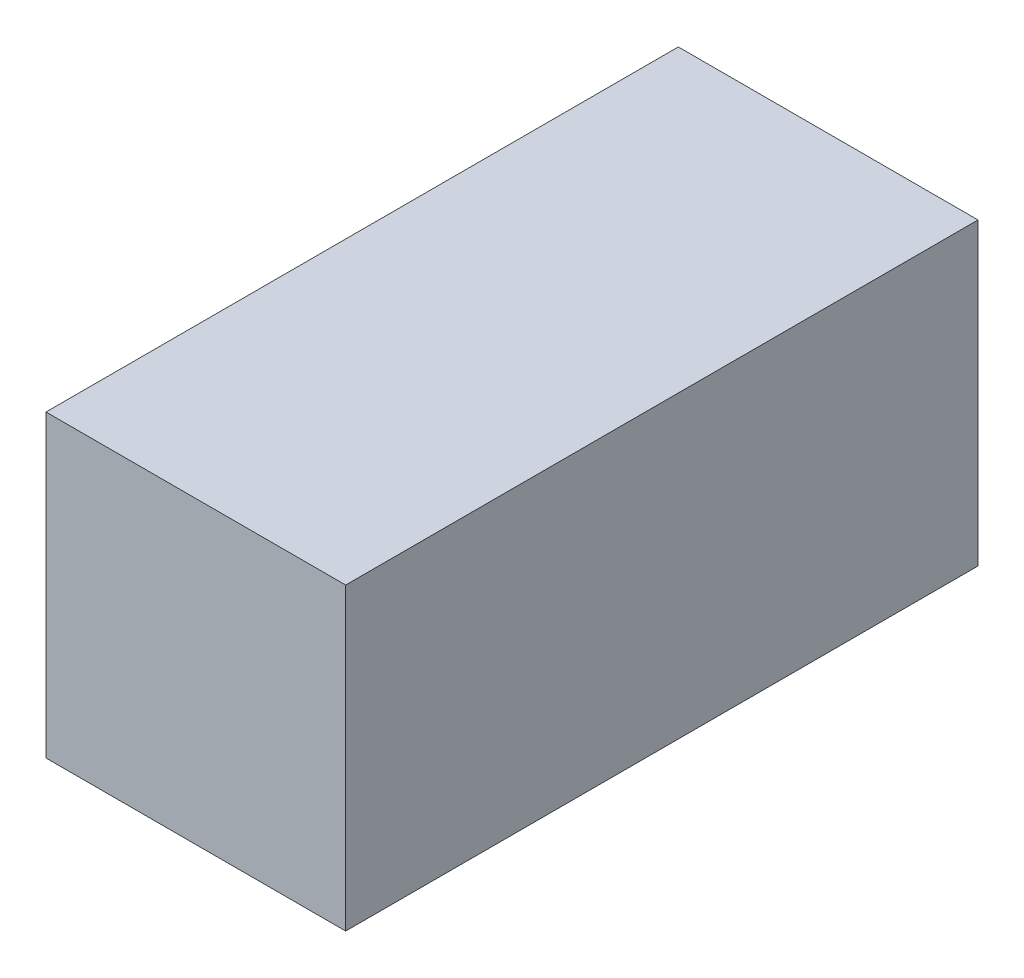
ISO-10303-21;
HEADER;
FILE_DESCRIPTION(('STEP AP214'),'2;1');
FILE_NAME('part.step','',(''),(''),'','','');
FILE_SCHEMA(('AUTOMOTIVE_DESIGN { 1 0 10303 214 1 1 1 1 }'));
ENDSEC;
DATA;
#1=APPLICATION_CONTEXT('core data for automotive mechanical design processes');
#2=APPLICATION_PROTOCOL_DEFINITION('international standard','automotive_design',2000,#1);
#3=PRODUCT_CONTEXT('',#1,'mechanical');
#4=PRODUCT('Part','Part','',(#3));
#5=PRODUCT_RELATED_PRODUCT_CATEGORY('part','',(#4));
#6=PRODUCT_DEFINITION_FORMATION('','',#4);
#7=PRODUCT_DEFINITION_CONTEXT('part definition',#1,'design');
#8=PRODUCT_DEFINITION('design','',#6,#7);
#9=PRODUCT_DEFINITION_SHAPE('','',#8);
#10=(LENGTH_UNIT() NAMED_UNIT(*) SI_UNIT(.MILLI.,.METRE.));
#11=(NAMED_UNIT(*) PLANE_ANGLE_UNIT() SI_UNIT($,.RADIAN.));
#12=(NAMED_UNIT(*) SI_UNIT($,.STERADIAN.) SOLID_ANGLE_UNIT());
#13=UNCERTAINTY_MEASURE_WITH_UNIT(LENGTH_MEASURE(1.E-05),#10,'distance_accuracy_value','');
#14=(GEOMETRIC_REPRESENTATION_CONTEXT(3) GLOBAL_UNCERTAINTY_ASSIGNED_CONTEXT((#13)) GLOBAL_UNIT_ASSIGNED_CONTEXT((#10,
#11,#12)) REPRESENTATION_CONTEXT('',''));
#15=CARTESIAN_POINT('',(0.,0.,0.));
#16=DIRECTION('',(0.,0.,1.));
#17=DIRECTION('',(1.,0.,0.));
#18=AXIS2_PLACEMENT_3D('',#15,#16,#17);
#19=CARTESIAN_POINT('',(-38.7220011521101,31.4866887263154,53.594));
#20=DIRECTION('',(1.,0.,0.));
#21=DIRECTION('',(0.,0.,-1.));
#22=AXIS2_PLACEMENT_3D('',#19,#20,#21);
#23=PLANE('',#22);
#24=DIRECTION('',(0.,-1.,0.));
#25=VECTOR('',#24,1.);
#26=CARTESIAN_POINT('',(-38.7220011521101,31.4866887263154,0.));
#27=LINE('',#26,#25);
#28=CARTESIAN_POINT('',(-38.7220011521101,31.4866887263154,0.));
#29=VERTEX_POINT('',#28);
#30=CARTESIAN_POINT('',(-38.7220011521101,6.0866887263154,0.));
#31=VERTEX_POINT('',#30);
#32=EDGE_CURVE('E98',#29,#31,#27,.T.);
#33=ORIENTED_EDGE('',*,*,#32,.T.);
#34=DIRECTION('',(0.,0.,-1.));
#35=VECTOR('',#34,1.);
#36=CARTESIAN_POINT('',(-38.7220011521101,6.0866887263154,53.594));
#37=LINE('',#36,#35);
#38=CARTESIAN_POINT('',(-38.7220011521101,6.0866887263154,53.594));
#39=VERTEX_POINT('',#38);
#40=EDGE_CURVE('E11',#39,#31,#37,.T.);
#41=ORIENTED_EDGE('',*,*,#40,.F.);
#42=DIRECTION('',(0.,-1.,0.));
#43=VECTOR('',#42,1.);
#44=CARTESIAN_POINT('',(-38.7220011521101,31.4866887263154,53.594));
#45=LINE('',#44,#43);
#46=CARTESIAN_POINT('',(-38.7220011521101,31.4866887263154,53.594));
#47=VERTEX_POINT('',#46);
#48=EDGE_CURVE('E84',#47,#39,#45,.T.);
#49=ORIENTED_EDGE('',*,*,#48,.F.);
#50=DIRECTION('',(0.,0.,-1.));
#51=VECTOR('',#50,1.);
#52=CARTESIAN_POINT('',(-38.7220011521101,31.4866887263154,53.594));
#53=LINE('',#52,#51);
#54=EDGE_CURVE('E51',#47,#29,#53,.T.);
#55=ORIENTED_EDGE('',*,*,#54,.T.);
#56=EDGE_LOOP('',(#33,#41,#49,#55));
#57=FACE_BOUND('',#56,.T.);
#58=ADVANCED_FACE('F35',(#57),#23,.F.);
#59=CARTESIAN_POINT('',(-38.7220011521101,6.0866887263154,53.594));
#60=DIRECTION('',(0.,1.,0.));
#61=DIRECTION('',(0.,0.,1.));
#62=AXIS2_PLACEMENT_3D('',#59,#60,#61);
#63=PLANE('',#62);
#64=DIRECTION('',(1.,0.,0.));
#65=VECTOR('',#64,1.);
#66=CARTESIAN_POINT('',(-38.7220011521101,6.0866887263154,0.));
#67=LINE('',#66,#65);
#68=CARTESIAN_POINT('',(-13.3220011521101,6.0866887263154,0.));
#69=VERTEX_POINT('',#68);
#70=EDGE_CURVE('E89',#31,#69,#67,.T.);
#71=ORIENTED_EDGE('',*,*,#70,.T.);
#72=DIRECTION('',(0.,0.,-1.));
#73=VECTOR('',#72,1.);
#74=CARTESIAN_POINT('',(-13.3220011521101,6.0866887263154,53.594));
#75=LINE('',#74,#73);
#76=CARTESIAN_POINT('',(-13.3220011521101,6.0866887263154,53.594));
#77=VERTEX_POINT('',#76);
#78=EDGE_CURVE('E43',#77,#69,#75,.T.);
#79=ORIENTED_EDGE('',*,*,#78,.F.);
#80=DIRECTION('',(1.,0.,0.));
#81=VECTOR('',#80,1.);
#82=CARTESIAN_POINT('',(-38.7220011521101,6.0866887263154,53.594));
#83=LINE('',#82,#81);
#84=EDGE_CURVE('E76',#39,#77,#83,.T.);
#85=ORIENTED_EDGE('',*,*,#84,.F.);
#86=ORIENTED_EDGE('',*,*,#40,.T.);
#87=EDGE_LOOP('',(#71,#79,#85,#86));
#88=FACE_BOUND('',#87,.T.);
#89=ADVANCED_FACE('F88',(#88),#63,.F.);
#90=CARTESIAN_POINT('',(-13.3220011521101,31.4866887263154,53.594));
#91=DIRECTION('',(1.,0.,0.));
#92=DIRECTION('',(0.,0.,-1.));
#93=AXIS2_PLACEMENT_3D('',#90,#91,#92);
#94=PLANE('',#93);
#95=DIRECTION('',(0.,-1.,0.));
#96=VECTOR('',#95,1.);
#97=CARTESIAN_POINT('',(-13.3220011521101,31.4866887263154,0.));
#98=LINE('',#97,#96);
#99=CARTESIAN_POINT('',(-13.3220011521101,31.4866887263154,0.));
#100=VERTEX_POINT('',#99);
#101=EDGE_CURVE('E101',#100,#69,#98,.T.);
#102=ORIENTED_EDGE('',*,*,#101,.F.);
#103=DIRECTION('',(0.,0.,-1.));
#104=VECTOR('',#103,1.);
#105=CARTESIAN_POINT('',(-13.3220011521101,31.4866887263154,53.594));
#106=LINE('',#105,#104);
#107=CARTESIAN_POINT('',(-13.3220011521101,31.4866887263154,53.594));
#108=VERTEX_POINT('',#107);
#109=EDGE_CURVE('E65',#108,#100,#106,.T.);
#110=ORIENTED_EDGE('',*,*,#109,.F.);
#111=DIRECTION('',(0.,-1.,0.));
#112=VECTOR('',#111,1.);
#113=CARTESIAN_POINT('',(-13.3220011521101,31.4866887263154,53.594));
#114=LINE('',#113,#112);
#115=EDGE_CURVE('E83',#108,#77,#114,.T.);
#116=ORIENTED_EDGE('',*,*,#115,.T.);
#117=ORIENTED_EDGE('',*,*,#78,.T.);
#118=EDGE_LOOP('',(#102,#110,#116,#117));
#119=FACE_BOUND('',#118,.T.);
#120=ADVANCED_FACE('F92',(#119),#94,.T.);
#121=CARTESIAN_POINT('',(-38.7220011521101,31.4866887263154,53.594));
#122=DIRECTION('',(0.,1.,0.));
#123=DIRECTION('',(0.,0.,1.));
#124=AXIS2_PLACEMENT_3D('',#121,#122,#123);
#125=PLANE('',#124);
#126=DIRECTION('',(1.,0.,0.));
#127=VECTOR('',#126,1.);
#128=CARTESIAN_POINT('',(-38.7220011521101,31.4866887263154,0.));
#129=LINE('',#128,#127);
#130=EDGE_CURVE('E103',#29,#100,#129,.T.);
#131=ORIENTED_EDGE('',*,*,#130,.F.);
#132=ORIENTED_EDGE('',*,*,#54,.F.);
#133=DIRECTION('',(1.,0.,0.));
#134=VECTOR('',#133,1.);
#135=CARTESIAN_POINT('',(-38.7220011521101,31.4866887263154,53.594));
#136=LINE('',#135,#134);
#137=EDGE_CURVE('E93',#47,#108,#136,.T.);
#138=ORIENTED_EDGE('',*,*,#137,.T.);
#139=ORIENTED_EDGE('',*,*,#109,.T.);
#140=EDGE_LOOP('',(#131,#132,#138,#139));
#141=FACE_BOUND('',#140,.T.);
#142=ADVANCED_FACE('F109',(#141),#125,.T.);
#143=CARTESIAN_POINT('',(0.,0.,53.594));
#144=DIRECTION('',(0.,0.,1.));
#145=DIRECTION('',(1.,0.,0.));
#146=AXIS2_PLACEMENT_3D('',#143,#144,#145);
#147=PLANE('',#146);
#148=ORIENTED_EDGE('',*,*,#48,.T.);
#149=ORIENTED_EDGE('',*,*,#84,.T.);
#150=ORIENTED_EDGE('',*,*,#115,.F.);
#151=ORIENTED_EDGE('',*,*,#137,.F.);
#152=EDGE_LOOP('',(#148,#149,#150,#151));
#153=FACE_BOUND('',#152,.T.);
#154=ADVANCED_FACE('F80',(#153),#147,.T.);
#155=CARTESIAN_POINT('',(0.,0.,0.));
#156=DIRECTION('',(0.,0.,1.));
#157=DIRECTION('',(1.,0.,0.));
#158=AXIS2_PLACEMENT_3D('',#155,#156,#157);
#159=PLANE('',#158);
#160=ORIENTED_EDGE('',*,*,#32,.F.);
#161=ORIENTED_EDGE('',*,*,#130,.T.);
#162=ORIENTED_EDGE('',*,*,#101,.T.);
#163=ORIENTED_EDGE('',*,*,#70,.F.);
#164=EDGE_LOOP('',(#160,#161,#162,#163));
#165=FACE_BOUND('',#164,.T.);
#166=ADVANCED_FACE('F108',(#165),#159,.F.);
#167=CLOSED_SHELL('',(#58,#89,#120,#142,#154,#166));
#168=MANIFOLD_SOLID_BREP('B2',#167);
#169=ADVANCED_BREP_SHAPE_REPRESENTATION('',(#18,#168),#14);
#170=SHAPE_DEFINITION_REPRESENTATION(#9,#169);
ENDSEC;
END-ISO-10303-21;
